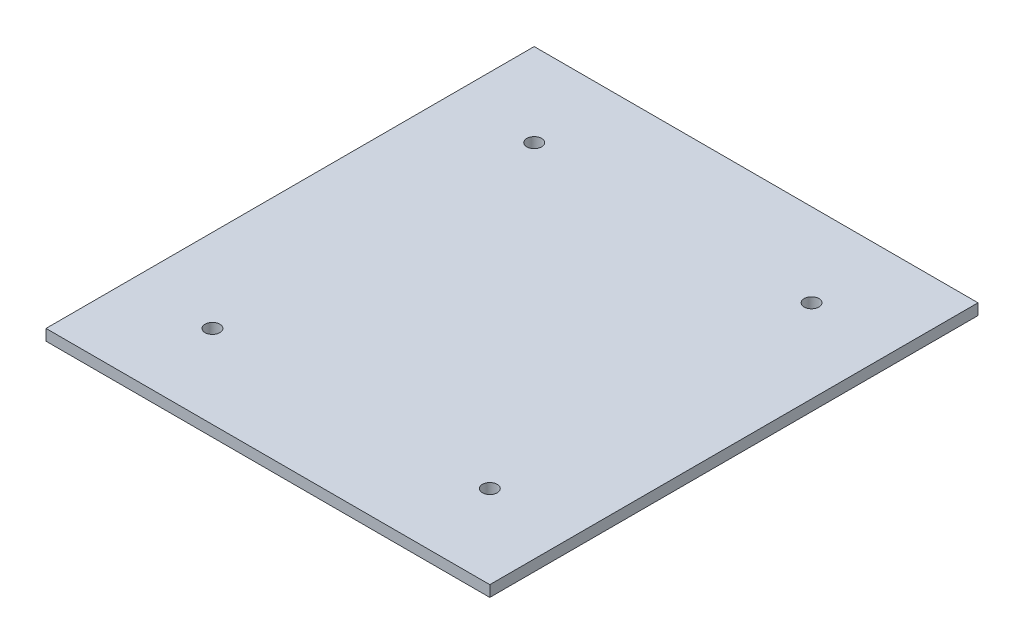
ISO-10303-21;
HEADER;
FILE_DESCRIPTION(('STEP AP214'),'2;1');
FILE_NAME('part.step','',(''),(''),'','','');
FILE_SCHEMA(('AUTOMOTIVE_DESIGN { 1 0 10303 214 1 1 1 1 }'));
ENDSEC;
DATA;
#1=APPLICATION_CONTEXT('core data for automotive mechanical design processes');
#2=APPLICATION_PROTOCOL_DEFINITION('international standard','automotive_design',2000,#1);
#3=PRODUCT_CONTEXT('',#1,'mechanical');
#4=PRODUCT('Part','Part','',(#3));
#5=PRODUCT_RELATED_PRODUCT_CATEGORY('part','',(#4));
#6=PRODUCT_DEFINITION_FORMATION('','',#4);
#7=PRODUCT_DEFINITION_CONTEXT('part definition',#1,'design');
#8=PRODUCT_DEFINITION('design','',#6,#7);
#9=PRODUCT_DEFINITION_SHAPE('','',#8);
#10=(LENGTH_UNIT() NAMED_UNIT(*) SI_UNIT(.MILLI.,.METRE.));
#11=(NAMED_UNIT(*) PLANE_ANGLE_UNIT() SI_UNIT($,.RADIAN.));
#12=(NAMED_UNIT(*) SI_UNIT($,.STERADIAN.) SOLID_ANGLE_UNIT());
#13=UNCERTAINTY_MEASURE_WITH_UNIT(LENGTH_MEASURE(1.E-05),#10,'distance_accuracy_value','');
#14=(GEOMETRIC_REPRESENTATION_CONTEXT(3) GLOBAL_UNCERTAINTY_ASSIGNED_CONTEXT((#13)) GLOBAL_UNIT_ASSIGNED_CONTEXT((#10,
#11,#12)) REPRESENTATION_CONTEXT('',''));
#15=CARTESIAN_POINT('',(0.,0.,0.));
#16=DIRECTION('',(0.,0.,1.));
#17=DIRECTION('',(1.,0.,0.));
#18=AXIS2_PLACEMENT_3D('',#15,#16,#17);
#19=CARTESIAN_POINT('',(60.,3.,0.));
#20=DIRECTION('',(1.,0.,0.));
#21=DIRECTION('',(0.,0.,-1.));
#22=AXIS2_PLACEMENT_3D('',#19,#20,#21);
#23=PLANE('',#22);
#24=DIRECTION('',(0.,0.,1.));
#25=VECTOR('',#24,1.);
#26=CARTESIAN_POINT('',(60.,0.,0.));
#27=LINE('',#26,#25);
#28=CARTESIAN_POINT('',(60.,0.,-66.));
#29=VERTEX_POINT('',#28);
#30=CARTESIAN_POINT('',(60.,0.,66.));
#31=VERTEX_POINT('',#30);
#32=EDGE_CURVE('E118',#29,#31,#27,.T.);
#33=ORIENTED_EDGE('',*,*,#32,.F.);
#34=DIRECTION('',(0.,-1.,0.));
#35=VECTOR('',#34,1.);
#36=CARTESIAN_POINT('',(60.,3.,-66.));
#37=LINE('',#36,#35);
#38=CARTESIAN_POINT('',(60.,3.,-66.));
#39=VERTEX_POINT('',#38);
#40=EDGE_CURVE('E11',#39,#29,#37,.T.);
#41=ORIENTED_EDGE('',*,*,#40,.F.);
#42=DIRECTION('',(0.,0.,1.));
#43=VECTOR('',#42,1.);
#44=CARTESIAN_POINT('',(60.,3.,0.));
#45=LINE('',#44,#43);
#46=CARTESIAN_POINT('',(60.,3.,66.));
#47=VERTEX_POINT('',#46);
#48=EDGE_CURVE('E99',#39,#47,#45,.T.);
#49=ORIENTED_EDGE('',*,*,#48,.T.);
#50=DIRECTION('',(0.,-1.,0.));
#51=VECTOR('',#50,1.);
#52=CARTESIAN_POINT('',(60.,3.,66.));
#53=LINE('',#52,#51);
#54=EDGE_CURVE('E77',#47,#31,#53,.T.);
#55=ORIENTED_EDGE('',*,*,#54,.T.);
#56=EDGE_LOOP('',(#33,#41,#49,#55));
#57=FACE_BOUND('',#56,.T.);
#58=ADVANCED_FACE('F37',(#57),#23,.T.);
#59=CARTESIAN_POINT('',(0.,3.,-66.));
#60=DIRECTION('',(0.,0.,-1.));
#61=DIRECTION('',(-1.,0.,0.));
#62=AXIS2_PLACEMENT_3D('',#59,#60,#61);
#63=PLANE('',#62);
#64=DIRECTION('',(1.,0.,0.));
#65=VECTOR('',#64,1.);
#66=CARTESIAN_POINT('',(0.,0.,-66.));
#67=LINE('',#66,#65);
#68=CARTESIAN_POINT('',(-60.,0.,-66.));
#69=VERTEX_POINT('',#68);
#70=EDGE_CURVE('E89',#69,#29,#67,.T.);
#71=ORIENTED_EDGE('',*,*,#70,.F.);
#72=DIRECTION('',(0.,-1.,0.));
#73=VECTOR('',#72,1.);
#74=CARTESIAN_POINT('',(-60.,3.,-66.));
#75=LINE('',#74,#73);
#76=CARTESIAN_POINT('',(-60.,3.,-66.));
#77=VERTEX_POINT('',#76);
#78=EDGE_CURVE('E46',#77,#69,#75,.T.);
#79=ORIENTED_EDGE('',*,*,#78,.F.);
#80=DIRECTION('',(1.,0.,0.));
#81=VECTOR('',#80,1.);
#82=CARTESIAN_POINT('',(0.,3.,-66.));
#83=LINE('',#82,#81);
#84=EDGE_CURVE('E87',#77,#39,#83,.T.);
#85=ORIENTED_EDGE('',*,*,#84,.T.);
#86=ORIENTED_EDGE('',*,*,#40,.T.);
#87=EDGE_LOOP('',(#71,#79,#85,#86));
#88=FACE_BOUND('',#87,.T.);
#89=ADVANCED_FACE('F85',(#88),#63,.T.);
#90=CARTESIAN_POINT('',(-60.,3.,0.));
#91=DIRECTION('',(1.,0.,0.));
#92=DIRECTION('',(0.,0.,-1.));
#93=AXIS2_PLACEMENT_3D('',#90,#91,#92);
#94=PLANE('',#93);
#95=DIRECTION('',(0.,0.,1.));
#96=VECTOR('',#95,1.);
#97=CARTESIAN_POINT('',(-60.,0.,0.));
#98=LINE('',#97,#96);
#99=CARTESIAN_POINT('',(-60.,0.,66.));
#100=VERTEX_POINT('',#99);
#101=EDGE_CURVE('E121',#69,#100,#98,.T.);
#102=ORIENTED_EDGE('',*,*,#101,.T.);
#103=DIRECTION('',(0.,-1.,0.));
#104=VECTOR('',#103,1.);
#105=CARTESIAN_POINT('',(-60.,3.,66.));
#106=LINE('',#105,#104);
#107=CARTESIAN_POINT('',(-60.,3.,66.));
#108=VERTEX_POINT('',#107);
#109=EDGE_CURVE('E92',#108,#100,#106,.T.);
#110=ORIENTED_EDGE('',*,*,#109,.F.);
#111=DIRECTION('',(0.,0.,1.));
#112=VECTOR('',#111,1.);
#113=CARTESIAN_POINT('',(-60.,3.,0.));
#114=LINE('',#113,#112);
#115=EDGE_CURVE('E94',#77,#108,#114,.T.);
#116=ORIENTED_EDGE('',*,*,#115,.F.);
#117=ORIENTED_EDGE('',*,*,#78,.T.);
#118=EDGE_LOOP('',(#102,#110,#116,#117));
#119=FACE_BOUND('',#118,.T.);
#120=ADVANCED_FACE('F95',(#119),#94,.F.);
#121=CARTESIAN_POINT('',(37.5,3.,-43.5));
#122=DIRECTION('',(0.,-1.,0.));
#123=DIRECTION('',(0.,0.,-1.));
#124=AXIS2_PLACEMENT_3D('',#121,#122,#123);
#125=CYLINDRICAL_SURFACE('',#124,2.);
#126=CARTESIAN_POINT('',(37.5,3.,-43.5));
#127=DIRECTION('',(0.,1.,0.));
#128=DIRECTION('',(0.,0.,1.));
#129=AXIS2_PLACEMENT_3D('',#126,#127,#128);
#130=CIRCLE('',#129,2.);
#131=CARTESIAN_POINT('',(37.5,3.,-41.5));
#132=VERTEX_POINT('',#131);
#133=EDGE_CURVE('E109',#132,#132,#130,.F.);
#134=ORIENTED_EDGE('',*,*,#133,.F.);
#135=EDGE_LOOP('',(#134));
#136=FACE_BOUND('',#135,.T.);
#137=CARTESIAN_POINT('',(37.5,0.,-43.5));
#138=DIRECTION('',(0.,1.,0.));
#139=DIRECTION('',(0.,0.,1.));
#140=AXIS2_PLACEMENT_3D('',#137,#138,#139);
#141=CIRCLE('',#140,2.);
#142=CARTESIAN_POINT('',(37.5,0.,-41.5));
#143=VERTEX_POINT('',#142);
#144=EDGE_CURVE('E127',#143,#143,#141,.F.);
#145=ORIENTED_EDGE('',*,*,#144,.T.);
#146=EDGE_LOOP('',(#145));
#147=FACE_BOUND('',#146,.T.);
#148=ADVANCED_FACE('F146',(#136,#147),#125,.F.);
#149=CARTESIAN_POINT('',(-37.5,3.,-43.5));
#150=DIRECTION('',(0.,-1.,0.));
#151=DIRECTION('',(0.,0.,-1.));
#152=AXIS2_PLACEMENT_3D('',#149,#150,#151);
#153=CYLINDRICAL_SURFACE('',#152,2.);
#154=CARTESIAN_POINT('',(-37.5,3.,-43.5));
#155=DIRECTION('',(0.,1.,0.));
#156=DIRECTION('',(0.,0.,1.));
#157=AXIS2_PLACEMENT_3D('',#154,#155,#156);
#158=CIRCLE('',#157,2.);
#159=CARTESIAN_POINT('',(-37.5,3.,-41.5));
#160=VERTEX_POINT('',#159);
#161=EDGE_CURVE('E106',#160,#160,#158,.T.);
#162=ORIENTED_EDGE('',*,*,#161,.T.);
#163=EDGE_LOOP('',(#162));
#164=FACE_BOUND('',#163,.T.);
#165=CARTESIAN_POINT('',(-37.5,0.,-43.5));
#166=DIRECTION('',(0.,1.,0.));
#167=DIRECTION('',(0.,0.,1.));
#168=AXIS2_PLACEMENT_3D('',#165,#166,#167);
#169=CIRCLE('',#168,2.);
#170=CARTESIAN_POINT('',(-37.5,0.,-41.5));
#171=VERTEX_POINT('',#170);
#172=EDGE_CURVE('E124',#171,#171,#169,.T.);
#173=ORIENTED_EDGE('',*,*,#172,.F.);
#174=EDGE_LOOP('',(#173));
#175=FACE_BOUND('',#174,.T.);
#176=ADVANCED_FACE('F149',(#164,#175),#153,.F.);
#177=CARTESIAN_POINT('',(0.,3.,66.));
#178=DIRECTION('',(0.,0.,-1.));
#179=DIRECTION('',(-1.,0.,0.));
#180=AXIS2_PLACEMENT_3D('',#177,#178,#179);
#181=PLANE('',#180);
#182=DIRECTION('',(1.,0.,0.));
#183=VECTOR('',#182,1.);
#184=CARTESIAN_POINT('',(0.,0.,66.));
#185=LINE('',#184,#183);
#186=EDGE_CURVE('E70',#100,#31,#185,.T.);
#187=ORIENTED_EDGE('',*,*,#186,.T.);
#188=ORIENTED_EDGE('',*,*,#54,.F.);
#189=DIRECTION('',(1.,0.,0.));
#190=VECTOR('',#189,1.);
#191=CARTESIAN_POINT('',(0.,3.,66.));
#192=LINE('',#191,#190);
#193=EDGE_CURVE('E54',#108,#47,#192,.T.);
#194=ORIENTED_EDGE('',*,*,#193,.F.);
#195=ORIENTED_EDGE('',*,*,#109,.T.);
#196=EDGE_LOOP('',(#187,#188,#194,#195));
#197=FACE_BOUND('',#196,.T.);
#198=ADVANCED_FACE('F135',(#197),#181,.F.);
#199=CARTESIAN_POINT('',(37.5,3.,43.5));
#200=DIRECTION('',(0.,-1.,0.));
#201=DIRECTION('',(0.,0.,-1.));
#202=AXIS2_PLACEMENT_3D('',#199,#200,#201);
#203=CYLINDRICAL_SURFACE('',#202,2.);
#204=CARTESIAN_POINT('',(37.5,3.,43.5));
#205=DIRECTION('',(0.,1.,0.));
#206=DIRECTION('',(0.,0.,1.));
#207=AXIS2_PLACEMENT_3D('',#204,#205,#206);
#208=CIRCLE('',#207,2.);
#209=CARTESIAN_POINT('',(37.5,3.,45.5));
#210=VERTEX_POINT('',#209);
#211=EDGE_CURVE('E101',#210,#210,#208,.T.);
#212=ORIENTED_EDGE('',*,*,#211,.T.);
#213=EDGE_LOOP('',(#212));
#214=FACE_BOUND('',#213,.T.);
#215=CARTESIAN_POINT('',(37.5,0.,43.5));
#216=DIRECTION('',(0.,1.,0.));
#217=DIRECTION('',(0.,0.,1.));
#218=AXIS2_PLACEMENT_3D('',#215,#216,#217);
#219=CIRCLE('',#218,2.);
#220=CARTESIAN_POINT('',(37.5,0.,45.5));
#221=VERTEX_POINT('',#220);
#222=EDGE_CURVE('E115',#221,#221,#219,.T.);
#223=ORIENTED_EDGE('',*,*,#222,.F.);
#224=EDGE_LOOP('',(#223));
#225=FACE_BOUND('',#224,.T.);
#226=ADVANCED_FACE('F39',(#214,#225),#203,.F.);
#227=CARTESIAN_POINT('',(-37.5,3.,43.5));
#228=DIRECTION('',(0.,-1.,0.));
#229=DIRECTION('',(0.,0.,-1.));
#230=AXIS2_PLACEMENT_3D('',#227,#228,#229);
#231=CYLINDRICAL_SURFACE('',#230,2.);
#232=CARTESIAN_POINT('',(-37.5,3.,43.5));
#233=DIRECTION('',(0.,1.,0.));
#234=DIRECTION('',(0.,0.,1.));
#235=AXIS2_PLACEMENT_3D('',#232,#233,#234);
#236=CIRCLE('',#235,2.);
#237=CARTESIAN_POINT('',(-37.5,3.,45.5));
#238=VERTEX_POINT('',#237);
#239=EDGE_CURVE('E112',#238,#238,#236,.F.);
#240=ORIENTED_EDGE('',*,*,#239,.F.);
#241=EDGE_LOOP('',(#240));
#242=FACE_BOUND('',#241,.T.);
#243=CARTESIAN_POINT('',(-37.5,0.,43.5));
#244=DIRECTION('',(0.,1.,0.));
#245=DIRECTION('',(0.,0.,1.));
#246=AXIS2_PLACEMENT_3D('',#243,#244,#245);
#247=CIRCLE('',#246,2.);
#248=CARTESIAN_POINT('',(-37.5,0.,45.5));
#249=VERTEX_POINT('',#248);
#250=EDGE_CURVE('E130',#249,#249,#247,.F.);
#251=ORIENTED_EDGE('',*,*,#250,.T.);
#252=EDGE_LOOP('',(#251));
#253=FACE_BOUND('',#252,.T.);
#254=ADVANCED_FACE('F156',(#242,#253),#231,.F.);
#255=CARTESIAN_POINT('',(0.,3.,0.));
#256=DIRECTION('',(0.,1.,0.));
#257=DIRECTION('',(0.,0.,1.));
#258=AXIS2_PLACEMENT_3D('',#255,#256,#257);
#259=PLANE('',#258);
#260=ORIENTED_EDGE('',*,*,#211,.F.);
#261=EDGE_LOOP('',(#260));
#262=FACE_BOUND('',#261,.T.);
#263=ORIENTED_EDGE('',*,*,#48,.F.);
#264=ORIENTED_EDGE('',*,*,#84,.F.);
#265=ORIENTED_EDGE('',*,*,#115,.T.);
#266=ORIENTED_EDGE('',*,*,#193,.T.);
#267=EDGE_LOOP('',(#263,#264,#265,#266));
#268=FACE_BOUND('',#267,.T.);
#269=ORIENTED_EDGE('',*,*,#161,.F.);
#270=EDGE_LOOP('',(#269));
#271=FACE_BOUND('',#270,.T.);
#272=ORIENTED_EDGE('',*,*,#133,.T.);
#273=EDGE_LOOP('',(#272));
#274=FACE_BOUND('',#273,.T.);
#275=ORIENTED_EDGE('',*,*,#239,.T.);
#276=EDGE_LOOP('',(#275));
#277=FACE_BOUND('',#276,.T.);
#278=ADVANCED_FACE('F97',(#262,#268,#271,#274,#277),#259,.T.);
#279=CARTESIAN_POINT('',(0.,0.,0.));
#280=DIRECTION('',(0.,1.,0.));
#281=DIRECTION('',(0.,0.,1.));
#282=AXIS2_PLACEMENT_3D('',#279,#280,#281);
#283=PLANE('',#282);
#284=ORIENTED_EDGE('',*,*,#222,.T.);
#285=EDGE_LOOP('',(#284));
#286=FACE_BOUND('',#285,.T.);
#287=ORIENTED_EDGE('',*,*,#32,.T.);
#288=ORIENTED_EDGE('',*,*,#186,.F.);
#289=ORIENTED_EDGE('',*,*,#101,.F.);
#290=ORIENTED_EDGE('',*,*,#70,.T.);
#291=EDGE_LOOP('',(#287,#288,#289,#290));
#292=FACE_BOUND('',#291,.T.);
#293=ORIENTED_EDGE('',*,*,#172,.T.);
#294=EDGE_LOOP('',(#293));
#295=FACE_BOUND('',#294,.T.);
#296=ORIENTED_EDGE('',*,*,#144,.F.);
#297=EDGE_LOOP('',(#296));
#298=FACE_BOUND('',#297,.T.);
#299=ORIENTED_EDGE('',*,*,#250,.F.);
#300=EDGE_LOOP('',(#299));
#301=FACE_BOUND('',#300,.T.);
#302=ADVANCED_FACE('F136',(#286,#292,#295,#298,#301),#283,.F.);
#303=CLOSED_SHELL('',(#58,#89,#120,#148,#176,#198,#226,#254,#278,#302));
#304=MANIFOLD_SOLID_BREP('B2',#303);
#305=ADVANCED_BREP_SHAPE_REPRESENTATION('',(#18,#304),#14);
#306=SHAPE_DEFINITION_REPRESENTATION(#9,#305);
ENDSEC;
END-ISO-10303-21;
